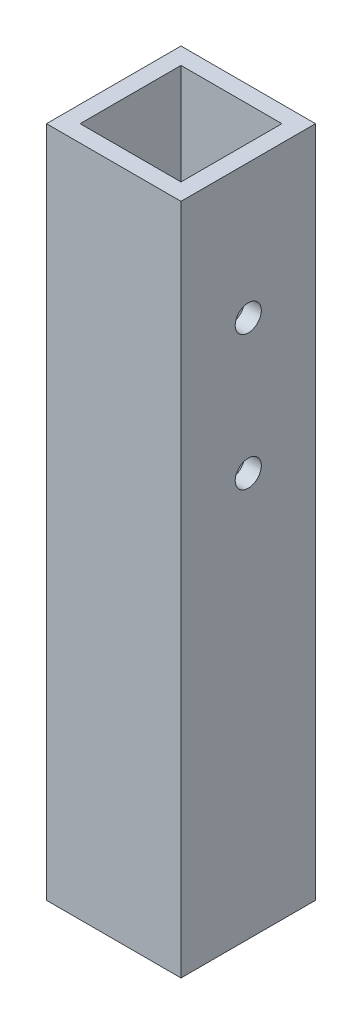
ISO-10303-21;
HEADER;
FILE_DESCRIPTION(('STEP AP214'),'2;1');
FILE_NAME('part.step','',(''),(''),'','','');
FILE_SCHEMA(('AUTOMOTIVE_DESIGN { 1 0 10303 214 1 1 1 1 }'));
ENDSEC;
DATA;
#1=APPLICATION_CONTEXT('core data for automotive mechanical design processes');
#2=APPLICATION_PROTOCOL_DEFINITION('international standard','automotive_design',2000,#1);
#3=PRODUCT_CONTEXT('',#1,'mechanical');
#4=PRODUCT('Part','Part','',(#3));
#5=PRODUCT_RELATED_PRODUCT_CATEGORY('part','',(#4));
#6=PRODUCT_DEFINITION_FORMATION('','',#4);
#7=PRODUCT_DEFINITION_CONTEXT('part definition',#1,'design');
#8=PRODUCT_DEFINITION('design','',#6,#7);
#9=PRODUCT_DEFINITION_SHAPE('','',#8);
#10=(LENGTH_UNIT() NAMED_UNIT(*) SI_UNIT(.MILLI.,.METRE.));
#11=(NAMED_UNIT(*) PLANE_ANGLE_UNIT() SI_UNIT($,.RADIAN.));
#12=(NAMED_UNIT(*) SI_UNIT($,.STERADIAN.) SOLID_ANGLE_UNIT());
#13=UNCERTAINTY_MEASURE_WITH_UNIT(LENGTH_MEASURE(1.E-05),#10,'distance_accuracy_value','');
#14=(GEOMETRIC_REPRESENTATION_CONTEXT(3) GLOBAL_UNCERTAINTY_ASSIGNED_CONTEXT((#13)) GLOBAL_UNIT_ASSIGNED_CONTEXT((#10,
#11,#12)) REPRESENTATION_CONTEXT('',''));
#15=CARTESIAN_POINT('',(0.,0.,0.));
#16=DIRECTION('',(0.,0.,1.));
#17=DIRECTION('',(1.,0.,0.));
#18=AXIS2_PLACEMENT_3D('',#15,#16,#17);
#19=CARTESIAN_POINT('',(0.,127.,0.));
#20=DIRECTION('',(0.,-1.,0.));
#21=DIRECTION('',(0.,0.,-1.));
#22=AXIS2_PLACEMENT_3D('',#19,#20,#21);
#23=PLANE('',#22);
#24=DIRECTION('',(0.,0.,-1.));
#25=VECTOR('',#24,1.);
#26=CARTESIAN_POINT('',(12.7,127.,12.7));
#27=LINE('',#26,#25);
#28=CARTESIAN_POINT('',(12.7,127.,12.7));
#29=VERTEX_POINT('',#28);
#30=CARTESIAN_POINT('',(12.7,127.,-12.7));
#31=VERTEX_POINT('',#30);
#32=EDGE_CURVE('E140',#29,#31,#27,.T.);
#33=ORIENTED_EDGE('',*,*,#32,.T.);
#34=DIRECTION('',(-1.,0.,0.));
#35=VECTOR('',#34,1.);
#36=CARTESIAN_POINT('',(-12.7,127.,-12.7));
#37=LINE('',#36,#35);
#38=CARTESIAN_POINT('',(-12.7,127.,-12.7));
#39=VERTEX_POINT('',#38);
#40=EDGE_CURVE('E143',#31,#39,#37,.T.);
#41=ORIENTED_EDGE('',*,*,#40,.T.);
#42=DIRECTION('',(0.,0.,1.));
#43=VECTOR('',#42,1.);
#44=CARTESIAN_POINT('',(-12.7,127.,12.7));
#45=LINE('',#44,#43);
#46=CARTESIAN_POINT('',(-12.7,127.,12.7));
#47=VERTEX_POINT('',#46);
#48=EDGE_CURVE('E146',#39,#47,#45,.T.);
#49=ORIENTED_EDGE('',*,*,#48,.T.);
#50=DIRECTION('',(1.,0.,0.));
#51=VECTOR('',#50,1.);
#52=CARTESIAN_POINT('',(-12.7,127.,12.7));
#53=LINE('',#52,#51);
#54=EDGE_CURVE('E148',#47,#29,#53,.T.);
#55=ORIENTED_EDGE('',*,*,#54,.T.);
#56=EDGE_LOOP('',(#33,#41,#49,#55));
#57=FACE_BOUND('',#56,.T.);
#58=DIRECTION('',(1.,0.,0.));
#59=VECTOR('',#58,1.);
#60=CARTESIAN_POINT('',(-9.52500000000001,127.,9.525));
#61=LINE('',#60,#59);
#62=CARTESIAN_POINT('',(-9.52500000000001,127.,9.525));
#63=VERTEX_POINT('',#62);
#64=CARTESIAN_POINT('',(9.52499999999999,127.,9.525));
#65=VERTEX_POINT('',#64);
#66=EDGE_CURVE('E102',#63,#65,#61,.T.);
#67=ORIENTED_EDGE('',*,*,#66,.F.);
#68=DIRECTION('',(0.,0.,1.));
#69=VECTOR('',#68,1.);
#70=CARTESIAN_POINT('',(-9.52500000000001,127.,9.525));
#71=LINE('',#70,#69);
#72=CARTESIAN_POINT('',(-9.52500000000001,127.,-9.525));
#73=VERTEX_POINT('',#72);
#74=EDGE_CURVE('E124',#73,#63,#71,.T.);
#75=ORIENTED_EDGE('',*,*,#74,.F.);
#76=DIRECTION('',(-1.,0.,0.));
#77=VECTOR('',#76,1.);
#78=CARTESIAN_POINT('',(-9.52500000000001,127.,-9.525));
#79=LINE('',#78,#77);
#80=CARTESIAN_POINT('',(9.52499999999999,127.,-9.525));
#81=VERTEX_POINT('',#80);
#82=EDGE_CURVE('E122',#81,#73,#79,.T.);
#83=ORIENTED_EDGE('',*,*,#82,.F.);
#84=DIRECTION('',(0.,0.,-1.));
#85=VECTOR('',#84,1.);
#86=CARTESIAN_POINT('',(9.52499999999999,127.,9.525));
#87=LINE('',#86,#85);
#88=EDGE_CURVE('E110',#65,#81,#87,.T.);
#89=ORIENTED_EDGE('',*,*,#88,.F.);
#90=EDGE_LOOP('',(#67,#75,#83,#89));
#91=FACE_BOUND('',#90,.T.);
#92=ADVANCED_FACE('F35',(#57,#91),#23,.F.);
#93=CARTESIAN_POINT('',(0.,0.,0.));
#94=DIRECTION('',(0.,-1.,0.));
#95=DIRECTION('',(0.,0.,-1.));
#96=AXIS2_PLACEMENT_3D('',#93,#94,#95);
#97=PLANE('',#96);
#98=DIRECTION('',(0.,0.,-1.));
#99=VECTOR('',#98,1.);
#100=CARTESIAN_POINT('',(12.7,0.,12.7));
#101=LINE('',#100,#99);
#102=CARTESIAN_POINT('',(12.7,0.,12.7));
#103=VERTEX_POINT('',#102);
#104=CARTESIAN_POINT('',(12.7,0.,-12.7));
#105=VERTEX_POINT('',#104);
#106=EDGE_CURVE('E118',#103,#105,#101,.T.);
#107=ORIENTED_EDGE('',*,*,#106,.F.);
#108=DIRECTION('',(1.,0.,0.));
#109=VECTOR('',#108,1.);
#110=CARTESIAN_POINT('',(-12.7,0.,12.7));
#111=LINE('',#110,#109);
#112=CARTESIAN_POINT('',(-12.7,0.,12.7));
#113=VERTEX_POINT('',#112);
#114=EDGE_CURVE('E144',#113,#103,#111,.T.);
#115=ORIENTED_EDGE('',*,*,#114,.F.);
#116=DIRECTION('',(0.,0.,1.));
#117=VECTOR('',#116,1.);
#118=CARTESIAN_POINT('',(-12.7,0.,12.7));
#119=LINE('',#118,#117);
#120=CARTESIAN_POINT('',(-12.7,0.,-12.7));
#121=VERTEX_POINT('',#120);
#122=EDGE_CURVE('E155',#121,#113,#119,.T.);
#123=ORIENTED_EDGE('',*,*,#122,.F.);
#124=DIRECTION('',(-1.,0.,0.));
#125=VECTOR('',#124,1.);
#126=CARTESIAN_POINT('',(-12.7,0.,-12.7));
#127=LINE('',#126,#125);
#128=EDGE_CURVE('E153',#105,#121,#127,.T.);
#129=ORIENTED_EDGE('',*,*,#128,.F.);
#130=EDGE_LOOP('',(#107,#115,#123,#129));
#131=FACE_BOUND('',#130,.T.);
#132=DIRECTION('',(0.,0.,1.));
#133=VECTOR('',#132,1.);
#134=CARTESIAN_POINT('',(-9.52500000000001,0.,9.525));
#135=LINE('',#134,#133);
#136=CARTESIAN_POINT('',(-9.52500000000001,0.,-9.525));
#137=VERTEX_POINT('',#136);
#138=CARTESIAN_POINT('',(-9.52500000000001,0.,9.525));
#139=VERTEX_POINT('',#138);
#140=EDGE_CURVE('E111',#137,#139,#135,.T.);
#141=ORIENTED_EDGE('',*,*,#140,.T.);
#142=DIRECTION('',(1.,0.,0.));
#143=VECTOR('',#142,1.);
#144=CARTESIAN_POINT('',(-9.52500000000001,0.,9.525));
#145=LINE('',#144,#143);
#146=CARTESIAN_POINT('',(9.52499999999999,0.,9.525));
#147=VERTEX_POINT('',#146);
#148=EDGE_CURVE('E60',#139,#147,#145,.T.);
#149=ORIENTED_EDGE('',*,*,#148,.T.);
#150=DIRECTION('',(0.,0.,-1.));
#151=VECTOR('',#150,1.);
#152=CARTESIAN_POINT('',(9.52499999999999,0.,9.525));
#153=LINE('',#152,#151);
#154=CARTESIAN_POINT('',(9.52499999999999,0.,-9.525));
#155=VERTEX_POINT('',#154);
#156=EDGE_CURVE('E117',#147,#155,#153,.T.);
#157=ORIENTED_EDGE('',*,*,#156,.T.);
#158=DIRECTION('',(-1.,0.,0.));
#159=VECTOR('',#158,1.);
#160=CARTESIAN_POINT('',(-9.52500000000001,0.,-9.525));
#161=LINE('',#160,#159);
#162=EDGE_CURVE('E132',#155,#137,#161,.T.);
#163=ORIENTED_EDGE('',*,*,#162,.T.);
#164=EDGE_LOOP('',(#141,#149,#157,#163));
#165=FACE_BOUND('',#164,.T.);
#166=ADVANCED_FACE('F202',(#131,#165),#97,.T.);
#167=CARTESIAN_POINT('',(12.7,127.,12.7));
#168=DIRECTION('',(-1.,0.,0.));
#169=DIRECTION('',(0.,0.,1.));
#170=AXIS2_PLACEMENT_3D('',#167,#168,#169);
#171=PLANE('',#170);
#172=CARTESIAN_POINT('',(12.7,76.1999999999997,6.10622663543836E-13));
#173=DIRECTION('',(1.,0.,0.));
#174=DIRECTION('',(0.,0.,-1.));
#175=AXIS2_PLACEMENT_3D('',#172,#173,#174);
#176=CIRCLE('',#175,2.46380000000064);
#177=CARTESIAN_POINT('',(12.7,76.1999999999997,-2.46380000000003));
#178=VERTEX_POINT('',#177);
#179=EDGE_CURVE('E181',#178,#178,#176,.T.);
#180=ORIENTED_EDGE('',*,*,#179,.F.);
#181=EDGE_LOOP('',(#180));
#182=FACE_BOUND('',#181,.T.);
#183=CARTESIAN_POINT('',(12.7,101.6,6.10622663543836E-13));
#184=DIRECTION('',(1.,0.,0.));
#185=DIRECTION('',(0.,0.,-1.));
#186=AXIS2_PLACEMENT_3D('',#183,#184,#185);
#187=CIRCLE('',#186,2.46380000000064);
#188=CARTESIAN_POINT('',(12.7,101.6,-2.46380000000003));
#189=VERTEX_POINT('',#188);
#190=EDGE_CURVE('E171',#189,#189,#187,.T.);
#191=ORIENTED_EDGE('',*,*,#190,.F.);
#192=EDGE_LOOP('',(#191));
#193=FACE_BOUND('',#192,.T.);
#194=ORIENTED_EDGE('',*,*,#106,.T.);
#195=DIRECTION('',(0.,-1.,0.));
#196=VECTOR('',#195,1.);
#197=CARTESIAN_POINT('',(12.7,127.,-12.7));
#198=LINE('',#197,#196);
#199=EDGE_CURVE('E11',#31,#105,#198,.T.);
#200=ORIENTED_EDGE('',*,*,#199,.F.);
#201=ORIENTED_EDGE('',*,*,#32,.F.);
#202=DIRECTION('',(0.,-1.,0.));
#203=VECTOR('',#202,1.);
#204=CARTESIAN_POINT('',(12.7,127.,12.7));
#205=LINE('',#204,#203);
#206=EDGE_CURVE('E150',#29,#103,#205,.T.);
#207=ORIENTED_EDGE('',*,*,#206,.T.);
#208=EDGE_LOOP('',(#194,#200,#201,#207));
#209=FACE_BOUND('',#208,.T.);
#210=ADVANCED_FACE('F37',(#182,#193,#209),#171,.F.);
#211=CARTESIAN_POINT('',(-12.7,127.,-12.7));
#212=DIRECTION('',(0.,0.,1.));
#213=DIRECTION('',(1.,0.,0.));
#214=AXIS2_PLACEMENT_3D('',#211,#212,#213);
#215=PLANE('',#214);
#216=ORIENTED_EDGE('',*,*,#128,.T.);
#217=DIRECTION('',(0.,-1.,0.));
#218=VECTOR('',#217,1.);
#219=CARTESIAN_POINT('',(-12.7,127.,-12.7));
#220=LINE('',#219,#218);
#221=EDGE_CURVE('E44',#39,#121,#220,.T.);
#222=ORIENTED_EDGE('',*,*,#221,.F.);
#223=ORIENTED_EDGE('',*,*,#40,.F.);
#224=ORIENTED_EDGE('',*,*,#199,.T.);
#225=EDGE_LOOP('',(#216,#222,#223,#224));
#226=FACE_BOUND('',#225,.T.);
#227=ADVANCED_FACE('F227',(#226),#215,.F.);
#228=CARTESIAN_POINT('',(-12.7,127.,12.7));
#229=DIRECTION('',(1.,0.,0.));
#230=DIRECTION('',(0.,0.,-1.));
#231=AXIS2_PLACEMENT_3D('',#228,#229,#230);
#232=PLANE('',#231);
#233=CARTESIAN_POINT('',(-12.7,76.1999999999997,6.10622663543836E-13));
#234=DIRECTION('',(1.,0.,0.));
#235=DIRECTION('',(0.,0.,-1.));
#236=AXIS2_PLACEMENT_3D('',#233,#234,#235);
#237=CIRCLE('',#236,2.46380000000064);
#238=CARTESIAN_POINT('',(-12.7,76.1999999999997,-2.46380000000003));
#239=VERTEX_POINT('',#238);
#240=EDGE_CURVE('E184',#239,#239,#237,.T.);
#241=ORIENTED_EDGE('',*,*,#240,.T.);
#242=EDGE_LOOP('',(#241));
#243=FACE_BOUND('',#242,.T.);
#244=CARTESIAN_POINT('',(-12.7,101.6,6.10622663543836E-13));
#245=DIRECTION('',(1.,0.,0.));
#246=DIRECTION('',(0.,0.,-1.));
#247=AXIS2_PLACEMENT_3D('',#244,#245,#246);
#248=CIRCLE('',#247,2.46380000000064);
#249=CARTESIAN_POINT('',(-12.7,101.6,-2.46380000000003));
#250=VERTEX_POINT('',#249);
#251=EDGE_CURVE('E166',#250,#250,#248,.T.);
#252=ORIENTED_EDGE('',*,*,#251,.T.);
#253=EDGE_LOOP('',(#252));
#254=FACE_BOUND('',#253,.T.);
#255=ORIENTED_EDGE('',*,*,#122,.T.);
#256=DIRECTION('',(0.,-1.,0.));
#257=VECTOR('',#256,1.);
#258=CARTESIAN_POINT('',(-12.7,127.,12.7));
#259=LINE('',#258,#257);
#260=EDGE_CURVE('E160',#47,#113,#259,.T.);
#261=ORIENTED_EDGE('',*,*,#260,.F.);
#262=ORIENTED_EDGE('',*,*,#48,.F.);
#263=ORIENTED_EDGE('',*,*,#221,.T.);
#264=EDGE_LOOP('',(#255,#261,#262,#263));
#265=FACE_BOUND('',#264,.T.);
#266=ADVANCED_FACE('F224',(#243,#254,#265),#232,.F.);
#267=CARTESIAN_POINT('',(-12.7,127.,12.7));
#268=DIRECTION('',(0.,0.,-1.));
#269=DIRECTION('',(-1.,0.,0.));
#270=AXIS2_PLACEMENT_3D('',#267,#268,#269);
#271=PLANE('',#270);
#272=ORIENTED_EDGE('',*,*,#114,.T.);
#273=ORIENTED_EDGE('',*,*,#206,.F.);
#274=ORIENTED_EDGE('',*,*,#54,.F.);
#275=ORIENTED_EDGE('',*,*,#260,.T.);
#276=EDGE_LOOP('',(#272,#273,#274,#275));
#277=FACE_BOUND('',#276,.T.);
#278=ADVANCED_FACE('F221',(#277),#271,.F.);
#279=CARTESIAN_POINT('',(-9.52500000000001,127.,9.525));
#280=DIRECTION('',(0.,0.,-1.));
#281=DIRECTION('',(-1.,0.,0.));
#282=AXIS2_PLACEMENT_3D('',#279,#280,#281);
#283=PLANE('',#282);
#284=ORIENTED_EDGE('',*,*,#148,.F.);
#285=DIRECTION('',(0.,-1.,0.));
#286=VECTOR('',#285,1.);
#287=CARTESIAN_POINT('',(-9.52500000000001,127.,9.525));
#288=LINE('',#287,#286);
#289=EDGE_CURVE('E106',#63,#139,#288,.T.);
#290=ORIENTED_EDGE('',*,*,#289,.F.);
#291=ORIENTED_EDGE('',*,*,#66,.T.);
#292=DIRECTION('',(0.,-1.,0.));
#293=VECTOR('',#292,1.);
#294=CARTESIAN_POINT('',(9.52499999999999,127.,9.525));
#295=LINE('',#294,#293);
#296=EDGE_CURVE('E105',#65,#147,#295,.T.);
#297=ORIENTED_EDGE('',*,*,#296,.T.);
#298=EDGE_LOOP('',(#284,#290,#291,#297));
#299=FACE_BOUND('',#298,.T.);
#300=ADVANCED_FACE('F104',(#299),#283,.T.);
#301=CARTESIAN_POINT('',(9.52499999999999,127.,9.525));
#302=DIRECTION('',(-1.,0.,0.));
#303=DIRECTION('',(0.,0.,1.));
#304=AXIS2_PLACEMENT_3D('',#301,#302,#303);
#305=PLANE('',#304);
#306=CARTESIAN_POINT('',(9.52499999999999,76.1999999999997,6.10622663543836E-13));
#307=DIRECTION('',(-1.,0.,0.));
#308=DIRECTION('',(0.,0.,1.));
#309=AXIS2_PLACEMENT_3D('',#306,#307,#308);
#310=CIRCLE('',#309,2.46380000000064);
#311=CARTESIAN_POINT('',(9.52499999999999,76.1999999999997,2.46380000000125));
#312=VERTEX_POINT('',#311);
#313=EDGE_CURVE('E176',#312,#312,#310,.T.);
#314=ORIENTED_EDGE('',*,*,#313,.F.);
#315=EDGE_LOOP('',(#314));
#316=FACE_BOUND('',#315,.T.);
#317=CARTESIAN_POINT('',(9.52499999999999,101.6,6.10622663543836E-13));
#318=DIRECTION('',(-1.,0.,0.));
#319=DIRECTION('',(0.,0.,1.));
#320=AXIS2_PLACEMENT_3D('',#317,#318,#319);
#321=CIRCLE('',#320,2.46380000000064);
#322=CARTESIAN_POINT('',(9.52499999999999,101.6,2.46380000000125));
#323=VERTEX_POINT('',#322);
#324=EDGE_CURVE('E130',#323,#323,#321,.T.);
#325=ORIENTED_EDGE('',*,*,#324,.F.);
#326=EDGE_LOOP('',(#325));
#327=FACE_BOUND('',#326,.T.);
#328=ORIENTED_EDGE('',*,*,#156,.F.);
#329=ORIENTED_EDGE('',*,*,#296,.F.);
#330=ORIENTED_EDGE('',*,*,#88,.T.);
#331=DIRECTION('',(0.,-1.,0.));
#332=VECTOR('',#331,1.);
#333=CARTESIAN_POINT('',(9.52499999999999,127.,-9.525));
#334=LINE('',#333,#332);
#335=EDGE_CURVE('E119',#81,#155,#334,.T.);
#336=ORIENTED_EDGE('',*,*,#335,.T.);
#337=EDGE_LOOP('',(#328,#329,#330,#336));
#338=FACE_BOUND('',#337,.T.);
#339=ADVANCED_FACE('F114',(#316,#327,#338),#305,.T.);
#340=CARTESIAN_POINT('',(-9.52500000000001,127.,-9.525));
#341=DIRECTION('',(0.,0.,1.));
#342=DIRECTION('',(1.,0.,0.));
#343=AXIS2_PLACEMENT_3D('',#340,#341,#342);
#344=PLANE('',#343);
#345=ORIENTED_EDGE('',*,*,#162,.F.);
#346=ORIENTED_EDGE('',*,*,#335,.F.);
#347=ORIENTED_EDGE('',*,*,#82,.T.);
#348=DIRECTION('',(0.,-1.,0.));
#349=VECTOR('',#348,1.);
#350=CARTESIAN_POINT('',(-9.52500000000001,127.,-9.525));
#351=LINE('',#350,#349);
#352=EDGE_CURVE('E52',#73,#137,#351,.T.);
#353=ORIENTED_EDGE('',*,*,#352,.T.);
#354=EDGE_LOOP('',(#345,#346,#347,#353));
#355=FACE_BOUND('',#354,.T.);
#356=ADVANCED_FACE('F198',(#355),#344,.T.);
#357=CARTESIAN_POINT('',(-9.52500000000001,127.,9.525));
#358=DIRECTION('',(1.,0.,0.));
#359=DIRECTION('',(0.,0.,-1.));
#360=AXIS2_PLACEMENT_3D('',#357,#358,#359);
#361=PLANE('',#360);
#362=CARTESIAN_POINT('',(-9.52500000000001,76.1999999999997,6.10622663543836E-13));
#363=DIRECTION('',(1.,0.,0.));
#364=DIRECTION('',(0.,0.,-1.));
#365=AXIS2_PLACEMENT_3D('',#362,#363,#364);
#366=CIRCLE('',#365,2.46380000000064);
#367=CARTESIAN_POINT('',(-9.52500000000001,76.1999999999997,-2.46380000000003));
#368=VERTEX_POINT('',#367);
#369=EDGE_CURVE('E39',#368,#368,#366,.T.);
#370=ORIENTED_EDGE('',*,*,#369,.F.);
#371=EDGE_LOOP('',(#370));
#372=FACE_BOUND('',#371,.T.);
#373=CARTESIAN_POINT('',(-9.52500000000001,101.6,6.10622663543836E-13));
#374=DIRECTION('',(1.,0.,0.));
#375=DIRECTION('',(0.,0.,-1.));
#376=AXIS2_PLACEMENT_3D('',#373,#374,#375);
#377=CIRCLE('',#376,2.46380000000064);
#378=CARTESIAN_POINT('',(-9.52500000000001,101.6,-2.46380000000003));
#379=VERTEX_POINT('',#378);
#380=EDGE_CURVE('E164',#379,#379,#377,.T.);
#381=ORIENTED_EDGE('',*,*,#380,.F.);
#382=EDGE_LOOP('',(#381));
#383=FACE_BOUND('',#382,.T.);
#384=ORIENTED_EDGE('',*,*,#140,.F.);
#385=ORIENTED_EDGE('',*,*,#352,.F.);
#386=ORIENTED_EDGE('',*,*,#74,.T.);
#387=ORIENTED_EDGE('',*,*,#289,.T.);
#388=EDGE_LOOP('',(#384,#385,#386,#387));
#389=FACE_BOUND('',#388,.T.);
#390=ADVANCED_FACE('F194',(#372,#383,#389),#361,.T.);
#391=CARTESIAN_POINT('',(-12.7,101.6,6.10622663543836E-13));
#392=DIRECTION('',(1.,0.,0.));
#393=DIRECTION('',(0.,0.,-1.));
#394=AXIS2_PLACEMENT_3D('',#391,#392,#393);
#395=CYLINDRICAL_SURFACE('',#394,2.46380000000064);
#396=ORIENTED_EDGE('',*,*,#380,.T.);
#397=EDGE_LOOP('',(#396));
#398=FACE_BOUND('',#397,.T.);
#399=ORIENTED_EDGE('',*,*,#251,.F.);
#400=EDGE_LOOP('',(#399));
#401=FACE_BOUND('',#400,.T.);
#402=ADVANCED_FACE('F197',(#398,#401),#395,.F.);
#403=ORIENTED_EDGE('',*,*,#324,.T.);
#404=EDGE_LOOP('',(#403));
#405=FACE_BOUND('',#404,.T.);
#406=ORIENTED_EDGE('',*,*,#190,.T.);
#407=EDGE_LOOP('',(#406));
#408=FACE_BOUND('',#407,.T.);
#409=ADVANCED_FACE('F252',(#405,#408),#395,.F.);
#410=CARTESIAN_POINT('',(-12.7,76.1999999999997,6.10622663543836E-13));
#411=DIRECTION('',(1.,0.,0.));
#412=DIRECTION('',(0.,0.,-1.));
#413=AXIS2_PLACEMENT_3D('',#410,#411,#412);
#414=CYLINDRICAL_SURFACE('',#413,2.46380000000064);
#415=ORIENTED_EDGE('',*,*,#369,.T.);
#416=EDGE_LOOP('',(#415));
#417=FACE_BOUND('',#416,.T.);
#418=ORIENTED_EDGE('',*,*,#240,.F.);
#419=EDGE_LOOP('',(#418));
#420=FACE_BOUND('',#419,.T.);
#421=ADVANCED_FACE('F191',(#417,#420),#414,.F.);
#422=ORIENTED_EDGE('',*,*,#313,.T.);
#423=EDGE_LOOP('',(#422));
#424=FACE_BOUND('',#423,.T.);
#425=ORIENTED_EDGE('',*,*,#179,.T.);
#426=EDGE_LOOP('',(#425));
#427=FACE_BOUND('',#426,.T.);
#428=ADVANCED_FACE('F260',(#424,#427),#414,.F.);
#429=CLOSED_SHELL('',(#92,#166,#210,#227,#266,#278,#300,#339,#356,#390,#402,#409,#421,#428));
#430=MANIFOLD_SOLID_BREP('B2',#429);
#431=ADVANCED_BREP_SHAPE_REPRESENTATION('',(#18,#430),#14);
#432=SHAPE_DEFINITION_REPRESENTATION(#9,#431);
ENDSEC;
END-ISO-10303-21;
